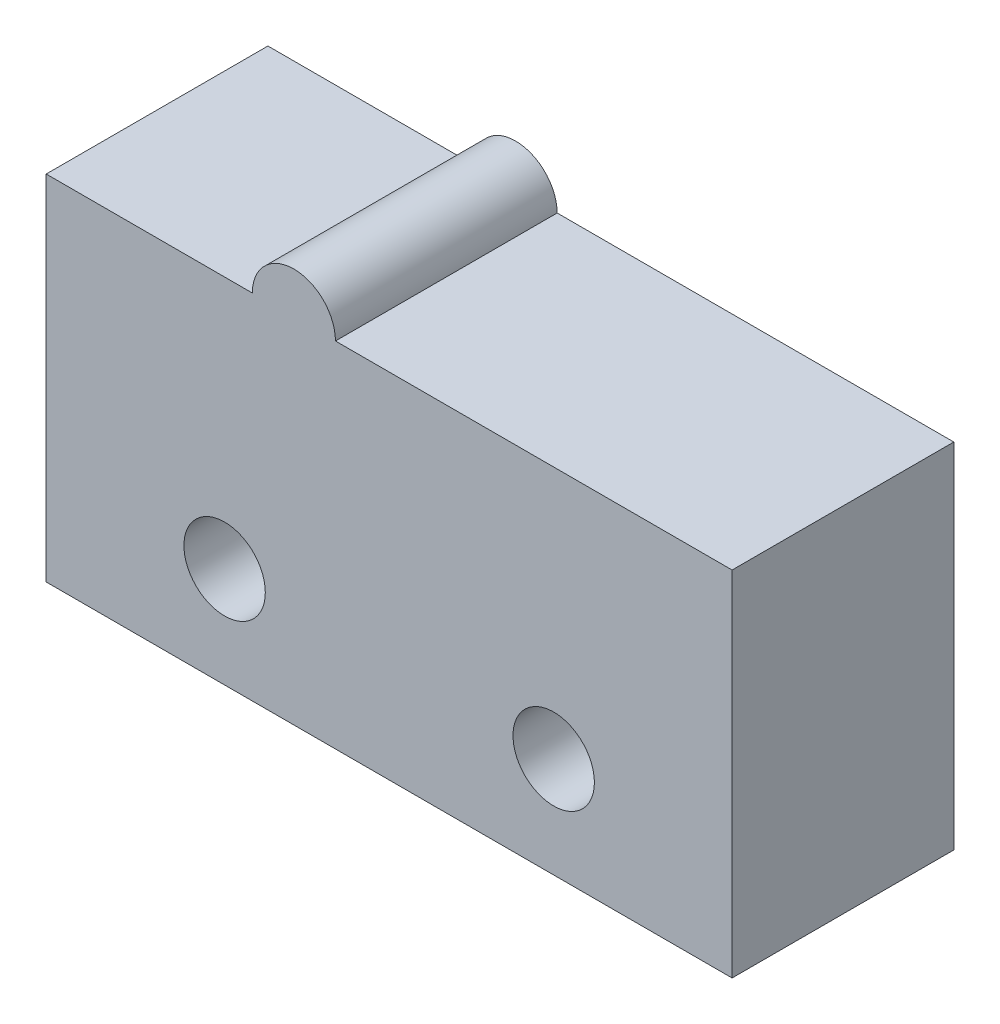
ISO-10303-21;
HEADER;
FILE_DESCRIPTION(('STEP AP214'),'2;1');
FILE_NAME('part.step','',(''),(''),'','','');
FILE_SCHEMA(('AUTOMOTIVE_DESIGN { 1 0 10303 214 1 1 1 1 }'));
ENDSEC;
DATA;
#1=APPLICATION_CONTEXT('core data for automotive mechanical design processes');
#2=APPLICATION_PROTOCOL_DEFINITION('international standard','automotive_design',2000,#1);
#3=PRODUCT_CONTEXT('',#1,'mechanical');
#4=PRODUCT('Part','Part','',(#3));
#5=PRODUCT_RELATED_PRODUCT_CATEGORY('part','',(#4));
#6=PRODUCT_DEFINITION_FORMATION('','',#4);
#7=PRODUCT_DEFINITION_CONTEXT('part definition',#1,'design');
#8=PRODUCT_DEFINITION('design','',#6,#7);
#9=PRODUCT_DEFINITION_SHAPE('','',#8);
#10=(LENGTH_UNIT() NAMED_UNIT(*) SI_UNIT(.MILLI.,.METRE.));
#11=(NAMED_UNIT(*) PLANE_ANGLE_UNIT() SI_UNIT($,.RADIAN.));
#12=(NAMED_UNIT(*) SI_UNIT($,.STERADIAN.) SOLID_ANGLE_UNIT());
#13=UNCERTAINTY_MEASURE_WITH_UNIT(LENGTH_MEASURE(1.E-05),#10,'distance_accuracy_value','');
#14=(GEOMETRIC_REPRESENTATION_CONTEXT(3) GLOBAL_UNCERTAINTY_ASSIGNED_CONTEXT((#13)) GLOBAL_UNIT_ASSIGNED_CONTEXT((#10,
#11,#12)) REPRESENTATION_CONTEXT('',''));
#15=CARTESIAN_POINT('',(0.,0.,0.));
#16=DIRECTION('',(0.,0.,1.));
#17=DIRECTION('',(1.,0.,0.));
#18=AXIS2_PLACEMENT_3D('',#15,#16,#17);
#19=CARTESIAN_POINT('',(7.15,10.2,6.4));
#20=DIRECTION('',(0.,0.,1.));
#21=DIRECTION('',(1.,0.,0.));
#22=AXIS2_PLACEMENT_3D('',#19,#20,#21);
#23=PLANE('',#22);
#24=CARTESIAN_POINT('',(14.65,2.9,6.4));
#25=DIRECTION('',(0.,0.,1.));
#26=DIRECTION('',(1.,0.,0.));
#27=AXIS2_PLACEMENT_3D('',#24,#25,#26);
#28=CIRCLE('',#27,1.175);
#29=CARTESIAN_POINT('',(15.825,2.9,6.4));
#30=VERTEX_POINT('',#29);
#31=EDGE_CURVE('E126',#30,#30,#28,.T.);
#32=ORIENTED_EDGE('',*,*,#31,.F.);
#33=EDGE_LOOP('',(#32));
#34=FACE_BOUND('',#33,.T.);
#35=DIRECTION('',(0.,-1.,0.));
#36=VECTOR('',#35,1.);
#37=CARTESIAN_POINT('',(0.,10.2,6.4));
#38=LINE('',#37,#36);
#39=CARTESIAN_POINT('',(0.,10.2,6.4));
#40=VERTEX_POINT('',#39);
#41=CARTESIAN_POINT('',(0.,0.,6.4));
#42=VERTEX_POINT('',#41);
#43=EDGE_CURVE('E133',#40,#42,#38,.T.);
#44=ORIENTED_EDGE('',*,*,#43,.T.);
#45=DIRECTION('',(1.,0.,0.));
#46=VECTOR('',#45,1.);
#47=CARTESIAN_POINT('',(0.,0.,6.4));
#48=LINE('',#47,#46);
#49=CARTESIAN_POINT('',(19.8,0.,6.4));
#50=VERTEX_POINT('',#49);
#51=EDGE_CURVE('E91',#42,#50,#48,.T.);
#52=ORIENTED_EDGE('',*,*,#51,.T.);
#53=DIRECTION('',(0.,1.,0.));
#54=VECTOR('',#53,1.);
#55=CARTESIAN_POINT('',(19.8,0.,6.4));
#56=LINE('',#55,#54);
#57=CARTESIAN_POINT('',(19.8,10.2,6.4));
#58=VERTEX_POINT('',#57);
#59=EDGE_CURVE('E104',#50,#58,#56,.T.);
#60=ORIENTED_EDGE('',*,*,#59,.T.);
#61=DIRECTION('',(-1.,0.,0.));
#62=VECTOR('',#61,1.);
#63=CARTESIAN_POINT('',(19.8,10.2,6.4));
#64=LINE('',#63,#62);
#65=CARTESIAN_POINT('',(8.35,10.2,6.4));
#66=VERTEX_POINT('',#65);
#67=EDGE_CURVE('E98',#58,#66,#64,.T.);
#68=ORIENTED_EDGE('',*,*,#67,.T.);
#69=CARTESIAN_POINT('',(7.15,10.2,6.4));
#70=DIRECTION('',(0.,0.,1.));
#71=DIRECTION('',(1.,0.,0.));
#72=AXIS2_PLACEMENT_3D('',#69,#70,#71);
#73=CIRCLE('',#72,1.2);
#74=CARTESIAN_POINT('',(5.94999999999999,10.2,6.4));
#75=VERTEX_POINT('',#74);
#76=EDGE_CURVE('E102',#66,#75,#73,.T.);
#77=ORIENTED_EDGE('',*,*,#76,.T.);
#78=DIRECTION('',(-1.,0.,0.));
#79=VECTOR('',#78,1.);
#80=CARTESIAN_POINT('',(5.95,10.2,6.4));
#81=LINE('',#80,#79);
#82=EDGE_CURVE('E54',#75,#40,#81,.T.);
#83=ORIENTED_EDGE('',*,*,#82,.T.);
#84=EDGE_LOOP('',(#44,#52,#60,#68,#77,#83));
#85=FACE_BOUND('',#84,.T.);
#86=CARTESIAN_POINT('',(5.15,2.9,6.4));
#87=DIRECTION('',(0.,0.,1.));
#88=DIRECTION('',(1.,0.,0.));
#89=AXIS2_PLACEMENT_3D('',#86,#87,#88);
#90=CIRCLE('',#89,1.175);
#91=CARTESIAN_POINT('',(6.325,2.9,6.4));
#92=VERTEX_POINT('',#91);
#93=EDGE_CURVE('E175',#92,#92,#90,.T.);
#94=ORIENTED_EDGE('',*,*,#93,.F.);
#95=EDGE_LOOP('',(#94));
#96=FACE_BOUND('',#95,.T.);
#97=ADVANCED_FACE('F37',(#34,#85,#96),#23,.T.);
#98=CARTESIAN_POINT('',(7.15,10.2,0.));
#99=DIRECTION('',(0.,0.,1.));
#100=DIRECTION('',(1.,0.,0.));
#101=AXIS2_PLACEMENT_3D('',#98,#99,#100);
#102=PLANE('',#101);
#103=DIRECTION('',(0.,-1.,0.));
#104=VECTOR('',#103,1.);
#105=CARTESIAN_POINT('',(0.,10.2,0.));
#106=LINE('',#105,#104);
#107=CARTESIAN_POINT('',(0.,10.2,0.));
#108=VERTEX_POINT('',#107);
#109=CARTESIAN_POINT('',(0.,0.,0.));
#110=VERTEX_POINT('',#109);
#111=EDGE_CURVE('E122',#108,#110,#106,.T.);
#112=ORIENTED_EDGE('',*,*,#111,.F.);
#113=DIRECTION('',(-1.,0.,0.));
#114=VECTOR('',#113,1.);
#115=CARTESIAN_POINT('',(5.95,10.2,0.));
#116=LINE('',#115,#114);
#117=CARTESIAN_POINT('',(5.94999999999999,10.2,0.));
#118=VERTEX_POINT('',#117);
#119=EDGE_CURVE('E83',#118,#108,#116,.T.);
#120=ORIENTED_EDGE('',*,*,#119,.F.);
#121=CARTESIAN_POINT('',(7.15,10.2,0.));
#122=DIRECTION('',(0.,0.,1.));
#123=DIRECTION('',(1.,0.,0.));
#124=AXIS2_PLACEMENT_3D('',#121,#122,#123);
#125=CIRCLE('',#124,1.2);
#126=CARTESIAN_POINT('',(8.35,10.2,0.));
#127=VERTEX_POINT('',#126);
#128=EDGE_CURVE('E77',#127,#118,#125,.T.);
#129=ORIENTED_EDGE('',*,*,#128,.F.);
#130=DIRECTION('',(-1.,0.,0.));
#131=VECTOR('',#130,1.);
#132=CARTESIAN_POINT('',(19.8,10.2,0.));
#133=LINE('',#132,#131);
#134=CARTESIAN_POINT('',(19.8,10.2,0.));
#135=VERTEX_POINT('',#134);
#136=EDGE_CURVE('E112',#135,#127,#133,.T.);
#137=ORIENTED_EDGE('',*,*,#136,.F.);
#138=DIRECTION('',(0.,1.,0.));
#139=VECTOR('',#138,1.);
#140=CARTESIAN_POINT('',(19.8,0.,0.));
#141=LINE('',#140,#139);
#142=CARTESIAN_POINT('',(19.8,0.,0.));
#143=VERTEX_POINT('',#142);
#144=EDGE_CURVE('E128',#143,#135,#141,.T.);
#145=ORIENTED_EDGE('',*,*,#144,.F.);
#146=DIRECTION('',(1.,0.,0.));
#147=VECTOR('',#146,1.);
#148=CARTESIAN_POINT('',(0.,0.,0.));
#149=LINE('',#148,#147);
#150=EDGE_CURVE('E125',#110,#143,#149,.T.);
#151=ORIENTED_EDGE('',*,*,#150,.F.);
#152=EDGE_LOOP('',(#112,#120,#129,#137,#145,#151));
#153=FACE_BOUND('',#152,.T.);
#154=CARTESIAN_POINT('',(14.65,2.9,0.));
#155=DIRECTION('',(0.,0.,1.));
#156=DIRECTION('',(1.,0.,0.));
#157=AXIS2_PLACEMENT_3D('',#154,#155,#156);
#158=CIRCLE('',#157,1.175);
#159=CARTESIAN_POINT('',(15.825,2.9,0.));
#160=VERTEX_POINT('',#159);
#161=EDGE_CURVE('E181',#160,#160,#158,.T.);
#162=ORIENTED_EDGE('',*,*,#161,.T.);
#163=EDGE_LOOP('',(#162));
#164=FACE_BOUND('',#163,.T.);
#165=CARTESIAN_POINT('',(5.15,2.9,0.));
#166=DIRECTION('',(0.,0.,1.));
#167=DIRECTION('',(1.,0.,0.));
#168=AXIS2_PLACEMENT_3D('',#165,#166,#167);
#169=CIRCLE('',#168,1.175);
#170=CARTESIAN_POINT('',(6.325,2.9,0.));
#171=VERTEX_POINT('',#170);
#172=EDGE_CURVE('E178',#171,#171,#169,.T.);
#173=ORIENTED_EDGE('',*,*,#172,.T.);
#174=EDGE_LOOP('',(#173));
#175=FACE_BOUND('',#174,.T.);
#176=ADVANCED_FACE('F142',(#153,#164,#175),#102,.F.);
#177=CARTESIAN_POINT('',(0.,10.2,6.4));
#178=DIRECTION('',(1.,0.,0.));
#179=DIRECTION('',(0.,0.,-1.));
#180=AXIS2_PLACEMENT_3D('',#177,#178,#179);
#181=PLANE('',#180);
#182=ORIENTED_EDGE('',*,*,#111,.T.);
#183=DIRECTION('',(0.,0.,-1.));
#184=VECTOR('',#183,1.);
#185=CARTESIAN_POINT('',(0.,0.,6.4));
#186=LINE('',#185,#184);
#187=EDGE_CURVE('E11',#42,#110,#186,.T.);
#188=ORIENTED_EDGE('',*,*,#187,.F.);
#189=ORIENTED_EDGE('',*,*,#43,.F.);
#190=DIRECTION('',(0.,0.,-1.));
#191=VECTOR('',#190,1.);
#192=CARTESIAN_POINT('',(0.,10.2,6.4));
#193=LINE('',#192,#191);
#194=EDGE_CURVE('E118',#40,#108,#193,.T.);
#195=ORIENTED_EDGE('',*,*,#194,.T.);
#196=EDGE_LOOP('',(#182,#188,#189,#195));
#197=FACE_BOUND('',#196,.T.);
#198=ADVANCED_FACE('F39',(#197),#181,.F.);
#199=CARTESIAN_POINT('',(0.,0.,6.4));
#200=DIRECTION('',(0.,1.,0.));
#201=DIRECTION('',(0.,0.,1.));
#202=AXIS2_PLACEMENT_3D('',#199,#200,#201);
#203=PLANE('',#202);
#204=ORIENTED_EDGE('',*,*,#150,.T.);
#205=DIRECTION('',(0.,0.,-1.));
#206=VECTOR('',#205,1.);
#207=CARTESIAN_POINT('',(19.8,0.,6.4));
#208=LINE('',#207,#206);
#209=EDGE_CURVE('E46',#50,#143,#208,.T.);
#210=ORIENTED_EDGE('',*,*,#209,.F.);
#211=ORIENTED_EDGE('',*,*,#51,.F.);
#212=ORIENTED_EDGE('',*,*,#187,.T.);
#213=EDGE_LOOP('',(#204,#210,#211,#212));
#214=FACE_BOUND('',#213,.T.);
#215=ADVANCED_FACE('F226',(#214),#203,.F.);
#216=CARTESIAN_POINT('',(19.8,0.,6.4));
#217=DIRECTION('',(-1.,0.,0.));
#218=DIRECTION('',(0.,0.,1.));
#219=AXIS2_PLACEMENT_3D('',#216,#217,#218);
#220=PLANE('',#219);
#221=ORIENTED_EDGE('',*,*,#144,.T.);
#222=DIRECTION('',(0.,0.,-1.));
#223=VECTOR('',#222,1.);
#224=CARTESIAN_POINT('',(19.8,10.2,6.4));
#225=LINE('',#224,#223);
#226=EDGE_CURVE('E113',#58,#135,#225,.T.);
#227=ORIENTED_EDGE('',*,*,#226,.F.);
#228=ORIENTED_EDGE('',*,*,#59,.F.);
#229=ORIENTED_EDGE('',*,*,#209,.T.);
#230=EDGE_LOOP('',(#221,#227,#228,#229));
#231=FACE_BOUND('',#230,.T.);
#232=ADVANCED_FACE('F139',(#231),#220,.F.);
#233=CARTESIAN_POINT('',(19.8,10.2,6.4));
#234=DIRECTION('',(0.,-1.,0.));
#235=DIRECTION('',(1.,0.,0.));
#236=AXIS2_PLACEMENT_3D('',#233,#234,#235);
#237=PLANE('',#236);
#238=ORIENTED_EDGE('',*,*,#136,.T.);
#239=DIRECTION('',(0.,0.,-1.));
#240=VECTOR('',#239,1.);
#241=CARTESIAN_POINT('',(8.35,10.2,6.4));
#242=LINE('',#241,#240);
#243=EDGE_CURVE('E109',#66,#127,#242,.T.);
#244=ORIENTED_EDGE('',*,*,#243,.F.);
#245=ORIENTED_EDGE('',*,*,#67,.F.);
#246=ORIENTED_EDGE('',*,*,#226,.T.);
#247=EDGE_LOOP('',(#238,#244,#245,#246));
#248=FACE_BOUND('',#247,.T.);
#249=ADVANCED_FACE('F110',(#248),#237,.F.);
#250=CARTESIAN_POINT('',(7.15,10.2,6.4));
#251=DIRECTION('',(0.,0.,-1.));
#252=DIRECTION('',(-1.,0.,0.));
#253=AXIS2_PLACEMENT_3D('',#250,#251,#252);
#254=CYLINDRICAL_SURFACE('',#253,1.2);
#255=ORIENTED_EDGE('',*,*,#128,.T.);
#256=DIRECTION('',(0.,0.,-1.));
#257=VECTOR('',#256,1.);
#258=CARTESIAN_POINT('',(5.94999999999999,10.2,6.4));
#259=LINE('',#258,#257);
#260=EDGE_CURVE('E114',#75,#118,#259,.T.);
#261=ORIENTED_EDGE('',*,*,#260,.F.);
#262=ORIENTED_EDGE('',*,*,#76,.F.);
#263=ORIENTED_EDGE('',*,*,#243,.T.);
#264=EDGE_LOOP('',(#255,#261,#262,#263));
#265=FACE_BOUND('',#264,.T.);
#266=ADVANCED_FACE('F116',(#265),#254,.T.);
#267=CARTESIAN_POINT('',(5.95,10.2,6.4));
#268=DIRECTION('',(0.,-1.,0.));
#269=DIRECTION('',(1.,0.,0.));
#270=AXIS2_PLACEMENT_3D('',#267,#268,#269);
#271=PLANE('',#270);
#272=ORIENTED_EDGE('',*,*,#119,.T.);
#273=ORIENTED_EDGE('',*,*,#194,.F.);
#274=ORIENTED_EDGE('',*,*,#82,.F.);
#275=ORIENTED_EDGE('',*,*,#260,.T.);
#276=EDGE_LOOP('',(#272,#273,#274,#275));
#277=FACE_BOUND('',#276,.T.);
#278=ADVANCED_FACE('F147',(#277),#271,.F.);
#279=CARTESIAN_POINT('',(14.65,2.9,6.4));
#280=DIRECTION('',(0.,0.,-1.));
#281=DIRECTION('',(-1.,0.,0.));
#282=AXIS2_PLACEMENT_3D('',#279,#280,#281);
#283=CYLINDRICAL_SURFACE('',#282,1.175);
#284=ORIENTED_EDGE('',*,*,#31,.T.);
#285=EDGE_LOOP('',(#284));
#286=FACE_BOUND('',#285,.T.);
#287=ORIENTED_EDGE('',*,*,#161,.F.);
#288=EDGE_LOOP('',(#287));
#289=FACE_BOUND('',#288,.T.);
#290=ADVANCED_FACE('F149',(#286,#289),#283,.F.);
#291=CARTESIAN_POINT('',(5.15,2.9,6.4));
#292=DIRECTION('',(0.,0.,-1.));
#293=DIRECTION('',(-1.,0.,0.));
#294=AXIS2_PLACEMENT_3D('',#291,#292,#293);
#295=CYLINDRICAL_SURFACE('',#294,1.175);
#296=ORIENTED_EDGE('',*,*,#93,.T.);
#297=EDGE_LOOP('',(#296));
#298=FACE_BOUND('',#297,.T.);
#299=ORIENTED_EDGE('',*,*,#172,.F.);
#300=EDGE_LOOP('',(#299));
#301=FACE_BOUND('',#300,.T.);
#302=ADVANCED_FACE('F155',(#298,#301),#295,.F.);
#303=CLOSED_SHELL('',(#97,#176,#198,#215,#232,#249,#266,#278,#290,#302));
#304=MANIFOLD_SOLID_BREP('B2',#303);
#305=ADVANCED_BREP_SHAPE_REPRESENTATION('',(#18,#304),#14);
#306=SHAPE_DEFINITION_REPRESENTATION(#9,#305);
ENDSEC;
END-ISO-10303-21;
